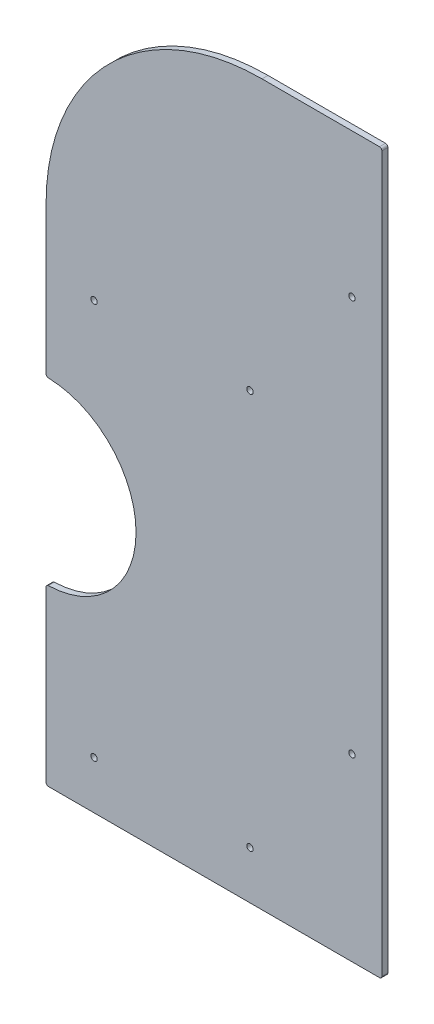
ISO-10303-21;
HEADER;
FILE_DESCRIPTION(('STEP AP214'),'2;1');
FILE_NAME('part.step','',(''),(''),'','','');
FILE_SCHEMA(('AUTOMOTIVE_DESIGN { 1 0 10303 214 1 1 1 1 }'));
ENDSEC;
DATA;
#1=APPLICATION_CONTEXT('core data for automotive mechanical design processes');
#2=APPLICATION_PROTOCOL_DEFINITION('international standard','automotive_design',2000,#1);
#3=PRODUCT_CONTEXT('',#1,'mechanical');
#4=PRODUCT('Part','Part','',(#3));
#5=PRODUCT_RELATED_PRODUCT_CATEGORY('part','',(#4));
#6=PRODUCT_DEFINITION_FORMATION('','',#4);
#7=PRODUCT_DEFINITION_CONTEXT('part definition',#1,'design');
#8=PRODUCT_DEFINITION('design','',#6,#7);
#9=PRODUCT_DEFINITION_SHAPE('','',#8);
#10=(LENGTH_UNIT() NAMED_UNIT(*) SI_UNIT(.MILLI.,.METRE.));
#11=(NAMED_UNIT(*) PLANE_ANGLE_UNIT() SI_UNIT($,.RADIAN.));
#12=(NAMED_UNIT(*) SI_UNIT($,.STERADIAN.) SOLID_ANGLE_UNIT());
#13=UNCERTAINTY_MEASURE_WITH_UNIT(LENGTH_MEASURE(1.E-05),#10,'distance_accuracy_value','');
#14=(GEOMETRIC_REPRESENTATION_CONTEXT(3) GLOBAL_UNCERTAINTY_ASSIGNED_CONTEXT((#13)) GLOBAL_UNIT_ASSIGNED_CONTEXT((#10,
#11,#12)) REPRESENTATION_CONTEXT('',''));
#15=CARTESIAN_POINT('',(0.,0.,0.));
#16=DIRECTION('',(0.,0.,1.));
#17=DIRECTION('',(1.,0.,0.));
#18=AXIS2_PLACEMENT_3D('',#15,#16,#17);
#19=CARTESIAN_POINT('',(-177.8,381.,6.35));
#20=DIRECTION('',(1.,0.,0.));
#21=DIRECTION('',(0.,1.,0.));
#22=AXIS2_PLACEMENT_3D('',#19,#20,#21);
#23=PLANE('',#22);
#24=DIRECTION('',(0.,-1.,0.));
#25=VECTOR('',#24,1.);
#26=CARTESIAN_POINT('',(-177.8,381.,0.));
#27=LINE('',#26,#25);
#28=CARTESIAN_POINT('',(-177.8,152.4,0.));
#29=VERTEX_POINT('',#28);
#30=CARTESIAN_POINT('',(-177.8,-3.84299257853687,0.));
#31=VERTEX_POINT('',#30);
#32=EDGE_CURVE('E144',#29,#31,#27,.T.);
#33=ORIENTED_EDGE('',*,*,#32,.T.);
#34=DIRECTION('',(0.,0.,1.));
#35=VECTOR('',#34,1.);
#36=CARTESIAN_POINT('',(-177.8,-3.84299257853687,6.35));
#37=LINE('',#36,#35);
#38=CARTESIAN_POINT('',(-177.8,-3.84299257853687,6.35));
#39=VERTEX_POINT('',#38);
#40=EDGE_CURVE('E12',#31,#39,#37,.T.);
#41=ORIENTED_EDGE('',*,*,#40,.T.);
#42=DIRECTION('',(0.,-1.,0.));
#43=VECTOR('',#42,1.);
#44=CARTESIAN_POINT('',(-177.8,381.,6.35));
#45=LINE('',#44,#43);
#46=CARTESIAN_POINT('',(-177.8,152.4,6.35));
#47=VERTEX_POINT('',#46);
#48=EDGE_CURVE('E146',#47,#39,#45,.T.);
#49=ORIENTED_EDGE('',*,*,#48,.F.);
#50=DIRECTION('',(0.,0.,-1.));
#51=VECTOR('',#50,1.);
#52=CARTESIAN_POINT('',(-177.8,152.4,6.35));
#53=LINE('',#52,#51);
#54=EDGE_CURVE('E132',#47,#29,#53,.T.);
#55=ORIENTED_EDGE('',*,*,#54,.T.);
#56=EDGE_LOOP('',(#33,#41,#49,#55));
#57=FACE_BOUND('',#56,.T.);
#58=ADVANCED_FACE('F37',(#57),#23,.F.);
#59=CARTESIAN_POINT('',(50.8,152.4,6.35));
#60=DIRECTION('',(0.,0.,-1.));
#61=DIRECTION('',(-1.,0.,0.));
#62=AXIS2_PLACEMENT_3D('',#59,#60,#61);
#63=CYLINDRICAL_SURFACE('',#62,228.6);
#64=ORIENTED_EDGE('',*,*,#54,.F.);
#65=CARTESIAN_POINT('',(50.8,152.4,6.35));
#66=DIRECTION('',(0.,0.,1.));
#67=DIRECTION('',(1.,0.,0.));
#68=AXIS2_PLACEMENT_3D('',#65,#66,#67);
#69=CIRCLE('',#68,228.6);
#70=CARTESIAN_POINT('',(50.8,381.,6.35));
#71=VERTEX_POINT('',#70);
#72=EDGE_CURVE('E140',#71,#47,#69,.T.);
#73=ORIENTED_EDGE('',*,*,#72,.F.);
#74=DIRECTION('',(0.,0.,-1.));
#75=VECTOR('',#74,1.);
#76=CARTESIAN_POINT('',(50.8,381.,6.35));
#77=LINE('',#76,#75);
#78=CARTESIAN_POINT('',(50.8,381.,0.));
#79=VERTEX_POINT('',#78);
#80=EDGE_CURVE('E135',#79,#71,#77,.F.);
#81=ORIENTED_EDGE('',*,*,#80,.F.);
#82=CARTESIAN_POINT('',(50.8,152.4,0.));
#83=DIRECTION('',(0.,0.,1.));
#84=DIRECTION('',(1.,0.,0.));
#85=AXIS2_PLACEMENT_3D('',#82,#83,#84);
#86=CIRCLE('',#85,228.6);
#87=EDGE_CURVE('E128',#29,#79,#86,.F.);
#88=ORIENTED_EDGE('',*,*,#87,.F.);
#89=EDGE_LOOP('',(#64,#73,#81,#88));
#90=FACE_BOUND('',#89,.T.);
#91=ADVANCED_FACE('F130',(#90),#63,.T.);
#92=CARTESIAN_POINT('',(177.8,381.,6.35));
#93=DIRECTION('',(-1.,0.,0.));
#94=DIRECTION('',(0.,-1.,0.));
#95=AXIS2_PLACEMENT_3D('',#92,#93,#94);
#96=PLANE('',#95);
#97=DIRECTION('',(0.,1.,0.));
#98=VECTOR('',#97,1.);
#99=CARTESIAN_POINT('',(177.8,381.,6.35));
#100=LINE('',#99,#98);
#101=CARTESIAN_POINT('',(177.8,-378.46,6.35));
#102=VERTEX_POINT('',#101);
#103=CARTESIAN_POINT('',(177.8,378.46,6.35));
#104=VERTEX_POINT('',#103);
#105=EDGE_CURVE('E158',#102,#104,#100,.T.);
#106=ORIENTED_EDGE('',*,*,#105,.F.);
#107=DIRECTION('',(0.,0.,-1.));
#108=VECTOR('',#107,1.);
#109=CARTESIAN_POINT('',(177.8,-378.46,6.35));
#110=LINE('',#109,#108);
#111=CARTESIAN_POINT('',(177.8,-378.46,0.));
#112=VERTEX_POINT('',#111);
#113=EDGE_CURVE('E197',#102,#112,#110,.T.);
#114=ORIENTED_EDGE('',*,*,#113,.T.);
#115=DIRECTION('',(0.,1.,0.));
#116=VECTOR('',#115,1.);
#117=CARTESIAN_POINT('',(177.8,381.,0.));
#118=LINE('',#117,#116);
#119=CARTESIAN_POINT('',(177.8,378.46,0.));
#120=VERTEX_POINT('',#119);
#121=EDGE_CURVE('E216',#112,#120,#118,.T.);
#122=ORIENTED_EDGE('',*,*,#121,.T.);
#123=DIRECTION('',(0.,0.,-1.));
#124=VECTOR('',#123,1.);
#125=CARTESIAN_POINT('',(177.8,378.46,6.35));
#126=LINE('',#125,#124);
#127=EDGE_CURVE('E195',#120,#104,#126,.F.);
#128=ORIENTED_EDGE('',*,*,#127,.T.);
#129=EDGE_LOOP('',(#106,#114,#122,#128));
#130=FACE_BOUND('',#129,.T.);
#131=ADVANCED_FACE('F249',(#130),#96,.F.);
#132=CARTESIAN_POINT('',(-177.8,381.,6.35));
#133=DIRECTION('',(0.,-1.,0.));
#134=DIRECTION('',(0.,0.,-1.));
#135=AXIS2_PLACEMENT_3D('',#132,#133,#134);
#136=PLANE('',#135);
#137=DIRECTION('',(-1.,0.,0.));
#138=VECTOR('',#137,1.);
#139=CARTESIAN_POINT('',(-177.8,381.,6.35));
#140=LINE('',#139,#138);
#141=CARTESIAN_POINT('',(175.26,381.,6.35));
#142=VERTEX_POINT('',#141);
#143=EDGE_CURVE('E251',#142,#71,#140,.T.);
#144=ORIENTED_EDGE('',*,*,#143,.F.);
#145=DIRECTION('',(0.,0.,-1.));
#146=VECTOR('',#145,1.);
#147=CARTESIAN_POINT('',(175.26,381.,6.35));
#148=LINE('',#147,#146);
#149=CARTESIAN_POINT('',(175.26,381.,0.));
#150=VERTEX_POINT('',#149);
#151=EDGE_CURVE('E200',#142,#150,#148,.T.);
#152=ORIENTED_EDGE('',*,*,#151,.T.);
#153=DIRECTION('',(-1.,0.,0.));
#154=VECTOR('',#153,1.);
#155=CARTESIAN_POINT('',(-177.8,381.,0.));
#156=LINE('',#155,#154);
#157=EDGE_CURVE('E161',#150,#79,#156,.T.);
#158=ORIENTED_EDGE('',*,*,#157,.T.);
#159=ORIENTED_EDGE('',*,*,#80,.T.);
#160=EDGE_LOOP('',(#144,#152,#158,#159));
#161=FACE_BOUND('',#160,.T.);
#162=ADVANCED_FACE('F244',(#161),#136,.F.);
#163=CARTESIAN_POINT('',(-177.8,-199.357007421463,0.));
#164=VERTEX_POINT('',#163);
#165=CARTESIAN_POINT('',(-177.8,-378.46,0.));
#166=VERTEX_POINT('',#165);
#167=EDGE_CURVE('E155',#164,#166,#27,.T.);
#168=ORIENTED_EDGE('',*,*,#167,.T.);
#169=DIRECTION('',(0.,0.,-1.));
#170=VECTOR('',#169,1.);
#171=CARTESIAN_POINT('',(-177.8,-378.46,6.35));
#172=LINE('',#171,#170);
#173=CARTESIAN_POINT('',(-177.8,-378.46,6.35));
#174=VERTEX_POINT('',#173);
#175=EDGE_CURVE('E185',#166,#174,#172,.F.);
#176=ORIENTED_EDGE('',*,*,#175,.T.);
#177=CARTESIAN_POINT('',(-177.8,-199.357007421463,6.35));
#178=VERTEX_POINT('',#177);
#179=EDGE_CURVE('E225',#178,#174,#45,.T.);
#180=ORIENTED_EDGE('',*,*,#179,.F.);
#181=DIRECTION('',(0.,0.,1.));
#182=VECTOR('',#181,1.);
#183=CARTESIAN_POINT('',(-177.8,-199.357007421463,6.35));
#184=LINE('',#183,#182);
#185=EDGE_CURVE('E182',#178,#164,#184,.F.);
#186=ORIENTED_EDGE('',*,*,#185,.T.);
#187=EDGE_LOOP('',(#168,#176,#180,#186));
#188=FACE_BOUND('',#187,.T.);
#189=ADVANCED_FACE('F223',(#188),#23,.F.);
#190=CARTESIAN_POINT('',(-177.8,-381.,6.35));
#191=DIRECTION('',(0.,1.,0.));
#192=DIRECTION('',(0.,0.,1.));
#193=AXIS2_PLACEMENT_3D('',#190,#191,#192);
#194=PLANE('',#193);
#195=DIRECTION('',(1.,0.,0.));
#196=VECTOR('',#195,1.);
#197=CARTESIAN_POINT('',(-177.8,-381.,6.35));
#198=LINE('',#197,#196);
#199=CARTESIAN_POINT('',(-175.26,-381.,6.35));
#200=VERTEX_POINT('',#199);
#201=CARTESIAN_POINT('',(175.26,-381.,6.35));
#202=VERTEX_POINT('',#201);
#203=EDGE_CURVE('E147',#200,#202,#198,.T.);
#204=ORIENTED_EDGE('',*,*,#203,.F.);
#205=DIRECTION('',(0.,0.,-1.));
#206=VECTOR('',#205,1.);
#207=CARTESIAN_POINT('',(-175.26,-381.,6.35));
#208=LINE('',#207,#206);
#209=CARTESIAN_POINT('',(-175.26,-381.,0.));
#210=VERTEX_POINT('',#209);
#211=EDGE_CURVE('E170',#200,#210,#208,.T.);
#212=ORIENTED_EDGE('',*,*,#211,.T.);
#213=DIRECTION('',(1.,0.,0.));
#214=VECTOR('',#213,1.);
#215=CARTESIAN_POINT('',(-177.8,-381.,0.));
#216=LINE('',#215,#214);
#217=CARTESIAN_POINT('',(175.26,-381.,0.));
#218=VERTEX_POINT('',#217);
#219=EDGE_CURVE('E154',#210,#218,#216,.T.);
#220=ORIENTED_EDGE('',*,*,#219,.T.);
#221=DIRECTION('',(0.,0.,-1.));
#222=VECTOR('',#221,1.);
#223=CARTESIAN_POINT('',(175.26,-381.,6.35));
#224=LINE('',#223,#222);
#225=EDGE_CURVE('E168',#218,#202,#224,.F.);
#226=ORIENTED_EDGE('',*,*,#225,.T.);
#227=EDGE_LOOP('',(#204,#212,#220,#226));
#228=FACE_BOUND('',#227,.T.);
#229=ADVANCED_FACE('F232',(#228),#194,.F.);
#230=CARTESIAN_POINT('',(0.,0.,6.35));
#231=DIRECTION('',(0.,0.,1.));
#232=DIRECTION('',(1.,0.,0.));
#233=AXIS2_PLACEMENT_3D('',#230,#231,#232);
#234=PLANE('',#233);
#235=CARTESIAN_POINT('',(146.05,228.6,6.35));
#236=DIRECTION('',(0.,0.,1.));
#237=DIRECTION('',(1.,0.,0.));
#238=AXIS2_PLACEMENT_3D('',#235,#236,#237);
#239=CIRCLE('',#238,3.3734375);
#240=CARTESIAN_POINT('',(149.4234375,228.6,6.35));
#241=VERTEX_POINT('',#240);
#242=EDGE_CURVE('E279',#241,#241,#239,.T.);
#243=ORIENTED_EDGE('',*,*,#242,.F.);
#244=EDGE_LOOP('',(#243));
#245=FACE_BOUND('',#244,.T.);
#246=CARTESIAN_POINT('',(-127.,-330.2,6.35));
#247=DIRECTION('',(0.,0.,1.));
#248=DIRECTION('',(1.,0.,0.));
#249=AXIS2_PLACEMENT_3D('',#246,#247,#248);
#250=CIRCLE('',#249,3.37343749999999);
#251=CARTESIAN_POINT('',(-123.6265625,-330.2,6.35));
#252=VERTEX_POINT('',#251);
#253=EDGE_CURVE('E258',#252,#252,#250,.T.);
#254=ORIENTED_EDGE('',*,*,#253,.F.);
#255=EDGE_LOOP('',(#254));
#256=FACE_BOUND('',#255,.T.);
#257=CARTESIAN_POINT('',(38.1,-330.2,6.35));
#258=DIRECTION('',(0.,0.,1.));
#259=DIRECTION('',(1.,0.,0.));
#260=AXIS2_PLACEMENT_3D('',#257,#258,#259);
#261=CIRCLE('',#260,3.37343750000001);
#262=CARTESIAN_POINT('',(41.4734375,-330.2,6.35));
#263=VERTEX_POINT('',#262);
#264=EDGE_CURVE('E257',#263,#263,#261,.T.);
#265=ORIENTED_EDGE('',*,*,#264,.F.);
#266=EDGE_LOOP('',(#265));
#267=FACE_BOUND('',#266,.T.);
#268=CARTESIAN_POINT('',(146.05,-190.5,6.35));
#269=DIRECTION('',(0.,0.,1.));
#270=DIRECTION('',(1.,0.,0.));
#271=AXIS2_PLACEMENT_3D('',#268,#269,#270);
#272=CIRCLE('',#271,3.3734375);
#273=CARTESIAN_POINT('',(149.4234375,-190.5,6.35));
#274=VERTEX_POINT('',#273);
#275=EDGE_CURVE('E264',#274,#274,#272,.T.);
#276=ORIENTED_EDGE('',*,*,#275,.F.);
#277=EDGE_LOOP('',(#276));
#278=FACE_BOUND('',#277,.T.);
#279=CARTESIAN_POINT('',(-127.,88.9,6.35));
#280=DIRECTION('',(0.,0.,1.));
#281=DIRECTION('',(1.,0.,0.));
#282=AXIS2_PLACEMENT_3D('',#279,#280,#281);
#283=CIRCLE('',#282,3.37343749999999);
#284=CARTESIAN_POINT('',(-123.6265625,88.9,6.35));
#285=VERTEX_POINT('',#284);
#286=EDGE_CURVE('E270',#285,#285,#283,.T.);
#287=ORIENTED_EDGE('',*,*,#286,.F.);
#288=EDGE_LOOP('',(#287));
#289=FACE_BOUND('',#288,.T.);
#290=CARTESIAN_POINT('',(38.1,88.9,6.35));
#291=DIRECTION('',(0.,0.,1.));
#292=DIRECTION('',(1.,0.,0.));
#293=AXIS2_PLACEMENT_3D('',#290,#291,#292);
#294=CIRCLE('',#293,3.3734375);
#295=CARTESIAN_POINT('',(41.4734375,88.9,6.35));
#296=VERTEX_POINT('',#295);
#297=EDGE_CURVE('E276',#296,#296,#294,.T.);
#298=ORIENTED_EDGE('',*,*,#297,.F.);
#299=EDGE_LOOP('',(#298));
#300=FACE_BOUND('',#299,.T.);
#301=ORIENTED_EDGE('',*,*,#179,.T.);
#302=CARTESIAN_POINT('',(-175.26,-378.46,6.35));
#303=DIRECTION('',(0.,0.,1.));
#304=DIRECTION('',(1.,0.,0.));
#305=AXIS2_PLACEMENT_3D('',#302,#303,#304);
#306=CIRCLE('',#305,2.54);
#307=EDGE_CURVE('E193',#174,#200,#306,.T.);
#308=ORIENTED_EDGE('',*,*,#307,.T.);
#309=ORIENTED_EDGE('',*,*,#203,.T.);
#310=CARTESIAN_POINT('',(175.26,-378.46,6.35));
#311=DIRECTION('',(0.,0.,1.));
#312=DIRECTION('',(1.,0.,0.));
#313=AXIS2_PLACEMENT_3D('',#310,#311,#312);
#314=CIRCLE('',#313,2.54);
#315=EDGE_CURVE('E191',#202,#102,#314,.T.);
#316=ORIENTED_EDGE('',*,*,#315,.T.);
#317=ORIENTED_EDGE('',*,*,#105,.T.);
#318=CARTESIAN_POINT('',(175.26,378.46,6.35));
#319=DIRECTION('',(0.,0.,1.));
#320=DIRECTION('',(1.,0.,0.));
#321=AXIS2_PLACEMENT_3D('',#318,#319,#320);
#322=CIRCLE('',#321,2.54);
#323=EDGE_CURVE('E59',#104,#142,#322,.T.);
#324=ORIENTED_EDGE('',*,*,#323,.T.);
#325=ORIENTED_EDGE('',*,*,#143,.T.);
#326=ORIENTED_EDGE('',*,*,#72,.T.);
#327=ORIENTED_EDGE('',*,*,#48,.T.);
#328=CARTESIAN_POINT('',(-175.26,-3.84299257853687,6.35));
#329=DIRECTION('',(0.,0.,1.));
#330=DIRECTION('',(1.,0.,0.));
#331=AXIS2_PLACEMENT_3D('',#328,#329,#330);
#332=CIRCLE('',#331,2.54);
#333=CARTESIAN_POINT('',(-175.325974025974,-6.38213562844502,6.35));
#334=VERTEX_POINT('',#333);
#335=EDGE_CURVE('E52',#39,#334,#332,.T.);
#336=ORIENTED_EDGE('',*,*,#335,.T.);
#337=CARTESIAN_POINT('',(-177.8,-101.6,6.35));
#338=DIRECTION('',(0.,0.,1.));
#339=DIRECTION('',(1.,0.,0.));
#340=AXIS2_PLACEMENT_3D('',#337,#338,#339);
#341=CIRCLE('',#340,95.25);
#342=CARTESIAN_POINT('',(-175.325974025974,-196.817864371555,6.35));
#343=VERTEX_POINT('',#342);
#344=EDGE_CURVE('E210',#343,#334,#341,.T.);
#345=ORIENTED_EDGE('',*,*,#344,.F.);
#346=CARTESIAN_POINT('',(-175.26,-199.357007421463,6.35));
#347=DIRECTION('',(0.,0.,1.));
#348=DIRECTION('',(1.,0.,0.));
#349=AXIS2_PLACEMENT_3D('',#346,#347,#348);
#350=CIRCLE('',#349,2.54);
#351=EDGE_CURVE('E188',#343,#178,#350,.T.);
#352=ORIENTED_EDGE('',*,*,#351,.T.);
#353=EDGE_LOOP('',(#301,#308,#309,#316,#317,#324,#325,#326,#327,#336,#345,#352));
#354=FACE_BOUND('',#353,.T.);
#355=ADVANCED_FACE('F214',(#245,#256,#267,#278,#289,#300,#354),#234,.T.);
#356=CARTESIAN_POINT('',(0.,0.,0.));
#357=DIRECTION('',(0.,0.,1.));
#358=DIRECTION('',(1.,0.,0.));
#359=AXIS2_PLACEMENT_3D('',#356,#357,#358);
#360=PLANE('',#359);
#361=CARTESIAN_POINT('',(146.05,228.6,0.));
#362=DIRECTION('',(0.,0.,1.));
#363=DIRECTION('',(1.,0.,0.));
#364=AXIS2_PLACEMENT_3D('',#361,#362,#363);
#365=CIRCLE('',#364,3.3734375);
#366=CARTESIAN_POINT('',(149.4234375,228.6,0.));
#367=VERTEX_POINT('',#366);
#368=EDGE_CURVE('E217',#367,#367,#365,.T.);
#369=ORIENTED_EDGE('',*,*,#368,.T.);
#370=EDGE_LOOP('',(#369));
#371=FACE_BOUND('',#370,.T.);
#372=CARTESIAN_POINT('',(-127.,-330.2,0.));
#373=DIRECTION('',(0.,0.,1.));
#374=DIRECTION('',(1.,0.,0.));
#375=AXIS2_PLACEMENT_3D('',#372,#373,#374);
#376=CIRCLE('',#375,3.37343749999999);
#377=CARTESIAN_POINT('',(-123.6265625,-330.2,0.));
#378=VERTEX_POINT('',#377);
#379=EDGE_CURVE('E280',#378,#378,#376,.T.);
#380=ORIENTED_EDGE('',*,*,#379,.T.);
#381=EDGE_LOOP('',(#380));
#382=FACE_BOUND('',#381,.T.);
#383=CARTESIAN_POINT('',(38.1,-330.2,0.));
#384=DIRECTION('',(0.,0.,1.));
#385=DIRECTION('',(1.,0.,0.));
#386=AXIS2_PLACEMENT_3D('',#383,#384,#385);
#387=CIRCLE('',#386,3.37343750000001);
#388=CARTESIAN_POINT('',(41.4734375,-330.2,0.));
#389=VERTEX_POINT('',#388);
#390=EDGE_CURVE('E254',#389,#389,#387,.T.);
#391=ORIENTED_EDGE('',*,*,#390,.T.);
#392=EDGE_LOOP('',(#391));
#393=FACE_BOUND('',#392,.T.);
#394=CARTESIAN_POINT('',(146.05,-190.5,0.));
#395=DIRECTION('',(0.,0.,1.));
#396=DIRECTION('',(1.,0.,0.));
#397=AXIS2_PLACEMENT_3D('',#394,#395,#396);
#398=CIRCLE('',#397,3.3734375);
#399=CARTESIAN_POINT('',(149.4234375,-190.5,0.));
#400=VERTEX_POINT('',#399);
#401=EDGE_CURVE('E261',#400,#400,#398,.T.);
#402=ORIENTED_EDGE('',*,*,#401,.T.);
#403=EDGE_LOOP('',(#402));
#404=FACE_BOUND('',#403,.T.);
#405=CARTESIAN_POINT('',(-127.,88.9,0.));
#406=DIRECTION('',(0.,0.,1.));
#407=DIRECTION('',(1.,0.,0.));
#408=AXIS2_PLACEMENT_3D('',#405,#406,#407);
#409=CIRCLE('',#408,3.37343749999999);
#410=CARTESIAN_POINT('',(-123.6265625,88.9,0.));
#411=VERTEX_POINT('',#410);
#412=EDGE_CURVE('E267',#411,#411,#409,.T.);
#413=ORIENTED_EDGE('',*,*,#412,.T.);
#414=EDGE_LOOP('',(#413));
#415=FACE_BOUND('',#414,.T.);
#416=CARTESIAN_POINT('',(38.1,88.9,0.));
#417=DIRECTION('',(0.,0.,1.));
#418=DIRECTION('',(1.,0.,0.));
#419=AXIS2_PLACEMENT_3D('',#416,#417,#418);
#420=CIRCLE('',#419,3.3734375);
#421=CARTESIAN_POINT('',(41.4734375,88.9,0.));
#422=VERTEX_POINT('',#421);
#423=EDGE_CURVE('E273',#422,#422,#420,.T.);
#424=ORIENTED_EDGE('',*,*,#423,.T.);
#425=EDGE_LOOP('',(#424));
#426=FACE_BOUND('',#425,.T.);
#427=ORIENTED_EDGE('',*,*,#219,.F.);
#428=CARTESIAN_POINT('',(-175.26,-378.46,0.));
#429=DIRECTION('',(0.,0.,1.));
#430=DIRECTION('',(1.,0.,0.));
#431=AXIS2_PLACEMENT_3D('',#428,#429,#430);
#432=CIRCLE('',#431,2.54);
#433=EDGE_CURVE('E180',#210,#166,#432,.F.);
#434=ORIENTED_EDGE('',*,*,#433,.T.);
#435=ORIENTED_EDGE('',*,*,#167,.F.);
#436=CARTESIAN_POINT('',(-175.26,-199.357007421463,0.));
#437=DIRECTION('',(0.,0.,1.));
#438=DIRECTION('',(1.,0.,0.));
#439=AXIS2_PLACEMENT_3D('',#436,#437,#438);
#440=CIRCLE('',#439,2.54);
#441=CARTESIAN_POINT('',(-175.325974025974,-196.817864371555,0.));
#442=VERTEX_POINT('',#441);
#443=EDGE_CURVE('E174',#164,#442,#440,.F.);
#444=ORIENTED_EDGE('',*,*,#443,.T.);
#445=CARTESIAN_POINT('',(-177.8,-101.6,0.));
#446=DIRECTION('',(0.,0.,1.));
#447=DIRECTION('',(1.,0.,0.));
#448=AXIS2_PLACEMENT_3D('',#445,#446,#447);
#449=CIRCLE('',#448,95.25);
#450=CARTESIAN_POINT('',(-175.325974025974,-6.38213562844502,0.));
#451=VERTEX_POINT('',#450);
#452=EDGE_CURVE('E139',#442,#451,#449,.T.);
#453=ORIENTED_EDGE('',*,*,#452,.T.);
#454=CARTESIAN_POINT('',(-175.26,-3.84299257853687,0.));
#455=DIRECTION('',(0.,0.,1.));
#456=DIRECTION('',(1.,0.,0.));
#457=AXIS2_PLACEMENT_3D('',#454,#455,#456);
#458=CIRCLE('',#457,2.54);
#459=EDGE_CURVE('E153',#451,#31,#458,.F.);
#460=ORIENTED_EDGE('',*,*,#459,.T.);
#461=ORIENTED_EDGE('',*,*,#32,.F.);
#462=ORIENTED_EDGE('',*,*,#87,.T.);
#463=ORIENTED_EDGE('',*,*,#157,.F.);
#464=CARTESIAN_POINT('',(175.26,378.46,0.));
#465=DIRECTION('',(0.,0.,1.));
#466=DIRECTION('',(1.,0.,0.));
#467=AXIS2_PLACEMENT_3D('',#464,#465,#466);
#468=CIRCLE('',#467,2.54);
#469=EDGE_CURVE('E176',#150,#120,#468,.F.);
#470=ORIENTED_EDGE('',*,*,#469,.T.);
#471=ORIENTED_EDGE('',*,*,#121,.F.);
#472=CARTESIAN_POINT('',(175.26,-378.46,0.));
#473=DIRECTION('',(0.,0.,1.));
#474=DIRECTION('',(1.,0.,0.));
#475=AXIS2_PLACEMENT_3D('',#472,#473,#474);
#476=CIRCLE('',#475,2.54);
#477=EDGE_CURVE('E178',#112,#218,#476,.F.);
#478=ORIENTED_EDGE('',*,*,#477,.T.);
#479=EDGE_LOOP('',(#427,#434,#435,#444,#453,#460,#461,#462,#463,#470,#471,#478));
#480=FACE_BOUND('',#479,.T.);
#481=ADVANCED_FACE('F150',(#371,#382,#393,#404,#415,#426,#480),#360,.F.);
#482=CARTESIAN_POINT('',(-177.8,-101.6,0.));
#483=DIRECTION('',(0.,0.,1.));
#484=DIRECTION('',(1.,0.,0.));
#485=AXIS2_PLACEMENT_3D('',#482,#483,#484);
#486=CYLINDRICAL_SURFACE('',#485,95.25);
#487=ORIENTED_EDGE('',*,*,#452,.F.);
#488=DIRECTION('',(0.,0.,1.));
#489=VECTOR('',#488,1.);
#490=CARTESIAN_POINT('',(-175.325974025974,-196.817864371555,0.));
#491=LINE('',#490,#489);
#492=EDGE_CURVE('E45',#442,#343,#491,.T.);
#493=ORIENTED_EDGE('',*,*,#492,.T.);
#494=ORIENTED_EDGE('',*,*,#344,.T.);
#495=DIRECTION('',(0.,0.,1.));
#496=VECTOR('',#495,1.);
#497=CARTESIAN_POINT('',(-175.325974025974,-6.38213562844502,0.));
#498=LINE('',#497,#496);
#499=EDGE_CURVE('E203',#334,#451,#498,.F.);
#500=ORIENTED_EDGE('',*,*,#499,.T.);
#501=EDGE_LOOP('',(#487,#493,#494,#500));
#502=FACE_BOUND('',#501,.T.);
#503=ADVANCED_FACE('F209',(#502),#486,.F.);
#504=CARTESIAN_POINT('',(38.1,88.9,0.));
#505=DIRECTION('',(0.,0.,1.));
#506=DIRECTION('',(1.,0.,0.));
#507=AXIS2_PLACEMENT_3D('',#504,#505,#506);
#508=CYLINDRICAL_SURFACE('',#507,3.3734375);
#509=ORIENTED_EDGE('',*,*,#423,.F.);
#510=EDGE_LOOP('',(#509));
#511=FACE_BOUND('',#510,.T.);
#512=ORIENTED_EDGE('',*,*,#297,.T.);
#513=EDGE_LOOP('',(#512));
#514=FACE_BOUND('',#513,.T.);
#515=ADVANCED_FACE('F312',(#511,#514),#508,.F.);
#516=CARTESIAN_POINT('',(-127.,88.9,0.));
#517=DIRECTION('',(0.,0.,1.));
#518=DIRECTION('',(1.,0.,0.));
#519=AXIS2_PLACEMENT_3D('',#516,#517,#518);
#520=CYLINDRICAL_SURFACE('',#519,3.37343749999999);
#521=ORIENTED_EDGE('',*,*,#412,.F.);
#522=EDGE_LOOP('',(#521));
#523=FACE_BOUND('',#522,.T.);
#524=ORIENTED_EDGE('',*,*,#286,.T.);
#525=EDGE_LOOP('',(#524));
#526=FACE_BOUND('',#525,.T.);
#527=ADVANCED_FACE('F314',(#523,#526),#520,.F.);
#528=CARTESIAN_POINT('',(146.05,-190.5,0.));
#529=DIRECTION('',(0.,0.,1.));
#530=DIRECTION('',(1.,0.,0.));
#531=AXIS2_PLACEMENT_3D('',#528,#529,#530);
#532=CYLINDRICAL_SURFACE('',#531,3.3734375);
#533=ORIENTED_EDGE('',*,*,#401,.F.);
#534=EDGE_LOOP('',(#533));
#535=FACE_BOUND('',#534,.T.);
#536=ORIENTED_EDGE('',*,*,#275,.T.);
#537=EDGE_LOOP('',(#536));
#538=FACE_BOUND('',#537,.T.);
#539=ADVANCED_FACE('F321',(#535,#538),#532,.F.);
#540=CARTESIAN_POINT('',(38.1,-330.2,0.));
#541=DIRECTION('',(0.,0.,1.));
#542=DIRECTION('',(1.,0.,0.));
#543=AXIS2_PLACEMENT_3D('',#540,#541,#542);
#544=CYLINDRICAL_SURFACE('',#543,3.37343750000001);
#545=ORIENTED_EDGE('',*,*,#390,.F.);
#546=EDGE_LOOP('',(#545));
#547=FACE_BOUND('',#546,.T.);
#548=ORIENTED_EDGE('',*,*,#264,.T.);
#549=EDGE_LOOP('',(#548));
#550=FACE_BOUND('',#549,.T.);
#551=ADVANCED_FACE('F441',(#547,#550),#544,.F.);
#552=CARTESIAN_POINT('',(-127.,-330.2,0.));
#553=DIRECTION('',(0.,0.,1.));
#554=DIRECTION('',(1.,0.,0.));
#555=AXIS2_PLACEMENT_3D('',#552,#553,#554);
#556=CYLINDRICAL_SURFACE('',#555,3.37343749999999);
#557=ORIENTED_EDGE('',*,*,#379,.F.);
#558=EDGE_LOOP('',(#557));
#559=FACE_BOUND('',#558,.T.);
#560=ORIENTED_EDGE('',*,*,#253,.T.);
#561=EDGE_LOOP('',(#560));
#562=FACE_BOUND('',#561,.T.);
#563=ADVANCED_FACE('F295',(#559,#562),#556,.F.);
#564=CARTESIAN_POINT('',(146.05,228.6,0.));
#565=DIRECTION('',(0.,0.,1.));
#566=DIRECTION('',(1.,0.,0.));
#567=AXIS2_PLACEMENT_3D('',#564,#565,#566);
#568=CYLINDRICAL_SURFACE('',#567,3.3734375);
#569=ORIENTED_EDGE('',*,*,#368,.F.);
#570=EDGE_LOOP('',(#569));
#571=FACE_BOUND('',#570,.T.);
#572=ORIENTED_EDGE('',*,*,#242,.T.);
#573=EDGE_LOOP('',(#572));
#574=FACE_BOUND('',#573,.T.);
#575=ADVANCED_FACE('F292',(#571,#574),#568,.F.);
#576=CARTESIAN_POINT('',(-175.26,-378.46,6.35));
#577=DIRECTION('',(0.,0.,-1.));
#578=DIRECTION('',(-1.,0.,0.));
#579=AXIS2_PLACEMENT_3D('',#576,#577,#578);
#580=CYLINDRICAL_SURFACE('',#579,2.54);
#581=ORIENTED_EDGE('',*,*,#307,.F.);
#582=ORIENTED_EDGE('',*,*,#175,.F.);
#583=ORIENTED_EDGE('',*,*,#433,.F.);
#584=ORIENTED_EDGE('',*,*,#211,.F.);
#585=EDGE_LOOP('',(#581,#582,#583,#584));
#586=FACE_BOUND('',#585,.T.);
#587=ADVANCED_FACE('F229',(#586),#580,.T.);
#588=CARTESIAN_POINT('',(175.26,-378.46,6.35));
#589=DIRECTION('',(0.,0.,-1.));
#590=DIRECTION('',(-1.,0.,0.));
#591=AXIS2_PLACEMENT_3D('',#588,#589,#590);
#592=CYLINDRICAL_SURFACE('',#591,2.54);
#593=ORIENTED_EDGE('',*,*,#315,.F.);
#594=ORIENTED_EDGE('',*,*,#225,.F.);
#595=ORIENTED_EDGE('',*,*,#477,.F.);
#596=ORIENTED_EDGE('',*,*,#113,.F.);
#597=EDGE_LOOP('',(#593,#594,#595,#596));
#598=FACE_BOUND('',#597,.T.);
#599=ADVANCED_FACE('F347',(#598),#592,.T.);
#600=CARTESIAN_POINT('',(175.26,378.46,6.35));
#601=DIRECTION('',(0.,0.,-1.));
#602=DIRECTION('',(-1.,0.,0.));
#603=AXIS2_PLACEMENT_3D('',#600,#601,#602);
#604=CYLINDRICAL_SURFACE('',#603,2.54);
#605=ORIENTED_EDGE('',*,*,#323,.F.);
#606=ORIENTED_EDGE('',*,*,#127,.F.);
#607=ORIENTED_EDGE('',*,*,#469,.F.);
#608=ORIENTED_EDGE('',*,*,#151,.F.);
#609=EDGE_LOOP('',(#605,#606,#607,#608));
#610=FACE_BOUND('',#609,.T.);
#611=ADVANCED_FACE('F247',(#610),#604,.T.);
#612=CARTESIAN_POINT('',(-175.26,-199.357007421463,0.));
#613=DIRECTION('',(0.,0.,1.));
#614=DIRECTION('',(1.,0.,0.));
#615=AXIS2_PLACEMENT_3D('',#612,#613,#614);
#616=CYLINDRICAL_SURFACE('',#615,2.54);
#617=ORIENTED_EDGE('',*,*,#351,.F.);
#618=ORIENTED_EDGE('',*,*,#492,.F.);
#619=ORIENTED_EDGE('',*,*,#443,.F.);
#620=ORIENTED_EDGE('',*,*,#185,.F.);
#621=EDGE_LOOP('',(#617,#618,#619,#620));
#622=FACE_BOUND('',#621,.T.);
#623=ADVANCED_FACE('F220',(#622),#616,.T.);
#624=CARTESIAN_POINT('',(-175.26,-3.84299257853687,0.));
#625=DIRECTION('',(0.,0.,1.));
#626=DIRECTION('',(1.,0.,0.));
#627=AXIS2_PLACEMENT_3D('',#624,#625,#626);
#628=CYLINDRICAL_SURFACE('',#627,2.54);
#629=ORIENTED_EDGE('',*,*,#459,.F.);
#630=ORIENTED_EDGE('',*,*,#499,.F.);
#631=ORIENTED_EDGE('',*,*,#335,.F.);
#632=ORIENTED_EDGE('',*,*,#40,.F.);
#633=EDGE_LOOP('',(#629,#630,#631,#632));
#634=FACE_BOUND('',#633,.T.);
#635=ADVANCED_FACE('F39',(#634),#628,.T.);
#636=CLOSED_SHELL('',(#58,#91,#131,#162,#189,#229,#355,#481,#503,#515,#527,#539,#551,#563,#575,
#587,#599,#611,#623,#635));
#637=MANIFOLD_SOLID_BREP('B2',#636);
#638=ADVANCED_BREP_SHAPE_REPRESENTATION('',(#18,#637),#14);
#639=SHAPE_DEFINITION_REPRESENTATION(#9,#638);
ENDSEC;
END-ISO-10303-21;
